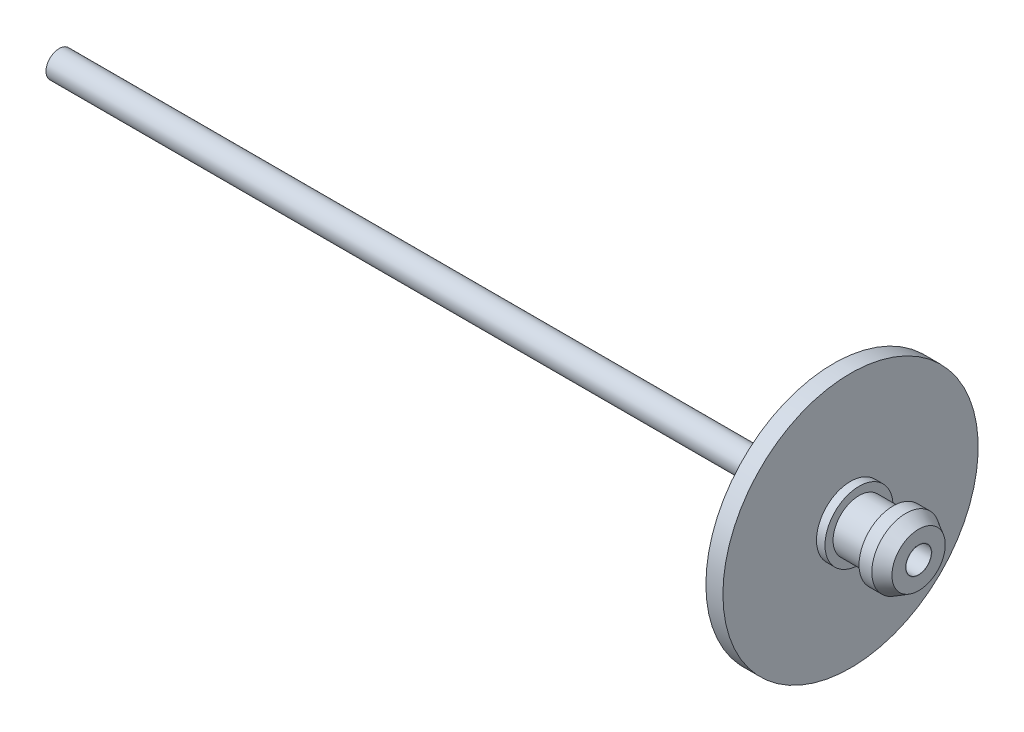
ISO-10303-21;
HEADER;
FILE_DESCRIPTION(('STEP AP214'),'2;1');
FILE_NAME('part.step','',(''),(''),'','','');
FILE_SCHEMA(('AUTOMOTIVE_DESIGN { 1 0 10303 214 1 1 1 1 }'));
ENDSEC;
DATA;
#1=APPLICATION_CONTEXT('core data for automotive mechanical design processes');
#2=APPLICATION_PROTOCOL_DEFINITION('international standard','automotive_design',2000,#1);
#3=PRODUCT_CONTEXT('',#1,'mechanical');
#4=PRODUCT('Part','Part','',(#3));
#5=PRODUCT_RELATED_PRODUCT_CATEGORY('part','',(#4));
#6=PRODUCT_DEFINITION_FORMATION('','',#4);
#7=PRODUCT_DEFINITION_CONTEXT('part definition',#1,'design');
#8=PRODUCT_DEFINITION('design','',#6,#7);
#9=PRODUCT_DEFINITION_SHAPE('','',#8);
#10=(LENGTH_UNIT() NAMED_UNIT(*) SI_UNIT(.MILLI.,.METRE.));
#11=(NAMED_UNIT(*) PLANE_ANGLE_UNIT() SI_UNIT($,.RADIAN.));
#12=(NAMED_UNIT(*) SI_UNIT($,.STERADIAN.) SOLID_ANGLE_UNIT());
#13=UNCERTAINTY_MEASURE_WITH_UNIT(LENGTH_MEASURE(1.E-05),#10,'distance_accuracy_value','');
#14=(GEOMETRIC_REPRESENTATION_CONTEXT(3) GLOBAL_UNCERTAINTY_ASSIGNED_CONTEXT((#13)) GLOBAL_UNIT_ASSIGNED_CONTEXT((#10,
#11,#12)) REPRESENTATION_CONTEXT('',''));
#15=CARTESIAN_POINT('',(0.,0.,0.));
#16=DIRECTION('',(0.,0.,1.));
#17=DIRECTION('',(1.,0.,0.));
#18=AXIS2_PLACEMENT_3D('',#15,#16,#17);
#19=CARTESIAN_POINT('',(-182.,0.,0.));
#20=DIRECTION('',(1.,0.,0.));
#21=DIRECTION('',(0.,0.,-1.));
#22=AXIS2_PLACEMENT_3D('',#19,#20,#21);
#23=CYLINDRICAL_SURFACE('',#22,3.1);
#24=CARTESIAN_POINT('',(-182.,0.,0.));
#25=DIRECTION('',(1.,0.,0.));
#26=DIRECTION('',(0.,0.,-1.));
#27=AXIS2_PLACEMENT_3D('',#24,#25,#26);
#28=CIRCLE('',#27,3.1);
#29=CARTESIAN_POINT('',(-182.,0.,-3.1));
#30=VERTEX_POINT('',#29);
#31=EDGE_CURVE('E11',#30,#30,#28,.T.);
#32=ORIENTED_EDGE('',*,*,#31,.T.);
#33=EDGE_LOOP('',(#32));
#34=FACE_BOUND('',#33,.T.);
#35=CARTESIAN_POINT('',(20.,0.,0.));
#36=DIRECTION('',(1.,0.,0.));
#37=DIRECTION('',(0.,0.,-1.));
#38=AXIS2_PLACEMENT_3D('',#35,#36,#37);
#39=CIRCLE('',#38,3.1);
#40=CARTESIAN_POINT('',(20.,0.,-3.1));
#41=VERTEX_POINT('',#40);
#42=EDGE_CURVE('E52',#41,#41,#39,.T.);
#43=ORIENTED_EDGE('',*,*,#42,.F.);
#44=EDGE_LOOP('',(#43));
#45=FACE_BOUND('',#44,.T.);
#46=ADVANCED_FACE('F49',(#34,#45),#23,.T.);
#47=CARTESIAN_POINT('',(-182.,0.,0.));
#48=DIRECTION('',(1.,0.,0.));
#49=DIRECTION('',(0.,0.,-1.));
#50=AXIS2_PLACEMENT_3D('',#47,#48,#49);
#51=PLANE('',#50);
#52=CARTESIAN_POINT('',(-182.,0.,0.));
#53=DIRECTION('',(1.,0.,0.));
#54=DIRECTION('',(0.,0.,-1.));
#55=AXIS2_PLACEMENT_3D('',#52,#53,#54);
#56=CIRCLE('',#55,3.);
#57=CARTESIAN_POINT('',(-182.,0.,-3.));
#58=VERTEX_POINT('',#57);
#59=EDGE_CURVE('E59',#58,#58,#56,.T.);
#60=ORIENTED_EDGE('',*,*,#59,.T.);
#61=EDGE_LOOP('',(#60));
#62=FACE_BOUND('',#61,.T.);
#63=ORIENTED_EDGE('',*,*,#31,.F.);
#64=EDGE_LOOP('',(#63));
#65=FACE_BOUND('',#64,.T.);
#66=ADVANCED_FACE('F67',(#62,#65),#51,.F.);
#67=CARTESIAN_POINT('',(20.,0.,0.));
#68=DIRECTION('',(1.,0.,0.));
#69=DIRECTION('',(0.,0.,-1.));
#70=AXIS2_PLACEMENT_3D('',#67,#68,#69);
#71=PLANE('',#70);
#72=CARTESIAN_POINT('',(20.,0.,0.));
#73=DIRECTION('',(1.,0.,0.));
#74=DIRECTION('',(0.,0.,-1.));
#75=AXIS2_PLACEMENT_3D('',#72,#73,#74);
#76=CIRCLE('',#75,3.);
#77=CARTESIAN_POINT('',(20.,0.,-3.));
#78=VERTEX_POINT('',#77);
#79=EDGE_CURVE('E61',#78,#78,#76,.T.);
#80=ORIENTED_EDGE('',*,*,#79,.F.);
#81=EDGE_LOOP('',(#80));
#82=FACE_BOUND('',#81,.T.);
#83=ORIENTED_EDGE('',*,*,#42,.T.);
#84=EDGE_LOOP('',(#83));
#85=FACE_BOUND('',#84,.T.);
#86=ADVANCED_FACE('F73',(#82,#85),#71,.T.);
#87=CARTESIAN_POINT('',(-182.,0.,0.));
#88=DIRECTION('',(1.,0.,0.));
#89=DIRECTION('',(0.,0.,-1.));
#90=AXIS2_PLACEMENT_3D('',#87,#88,#89);
#91=CYLINDRICAL_SURFACE('',#90,3.);
#92=ORIENTED_EDGE('',*,*,#59,.F.);
#93=EDGE_LOOP('',(#92));
#94=FACE_BOUND('',#93,.T.);
#95=ORIENTED_EDGE('',*,*,#79,.T.);
#96=EDGE_LOOP('',(#95));
#97=FACE_BOUND('',#96,.T.);
#98=ADVANCED_FACE('F70',(#94,#97),#91,.F.);
#99=CLOSED_SHELL('',(#46,#66,#86,#98));
#100=MANIFOLD_SOLID_BREP('B2_NOT_SHOWN',#99);
#101=CARTESIAN_POINT('',(0.,21.958452657574,0.));
#102=DIRECTION('',(1.,0.,0.));
#103=DIRECTION('',(0.,0.,-1.));
#104=AXIS2_PLACEMENT_3D('',#101,#102,#103);
#105=PLANE('',#104);
#106=CARTESIAN_POINT('',(0.,0.,0.));
#107=DIRECTION('',(-1.,0.,0.));
#108=DIRECTION('',(0.,0.,1.));
#109=AXIS2_PLACEMENT_3D('',#106,#107,#108);
#110=CIRCLE('',#109,3.1);
#111=CARTESIAN_POINT('',(0.,0.,3.1));
#112=VERTEX_POINT('',#111);
#113=EDGE_CURVE('E153',#112,#112,#110,.T.);
#114=ORIENTED_EDGE('',*,*,#113,.F.);
#115=EDGE_LOOP('',(#114));
#116=FACE_BOUND('',#115,.T.);
#117=CARTESIAN_POINT('',(0.,0.,0.));
#118=DIRECTION('',(-1.,0.,0.));
#119=DIRECTION('',(0.,0.,1.));
#120=AXIS2_PLACEMENT_3D('',#117,#118,#119);
#121=CIRCLE('',#120,30.);
#122=CARTESIAN_POINT('',(0.,0.,30.));
#123=VERTEX_POINT('',#122);
#124=EDGE_CURVE('E48',#123,#123,#121,.T.);
#125=ORIENTED_EDGE('',*,*,#124,.T.);
#126=EDGE_LOOP('',(#125));
#127=FACE_BOUND('',#126,.T.);
#128=ADVANCED_FACE('F111',(#116,#127),#105,.F.);
#129=CARTESIAN_POINT('',(0.,0.,0.));
#130=DIRECTION('',(-1.,0.,0.));
#131=DIRECTION('',(0.,0.,1.));
#132=AXIS2_PLACEMENT_3D('',#129,#130,#131);
#133=CYLINDRICAL_SURFACE('',#132,30.);
#134=ORIENTED_EDGE('',*,*,#124,.F.);
#135=EDGE_LOOP('',(#134));
#136=FACE_BOUND('',#135,.T.);
#137=CARTESIAN_POINT('',(4.,0.,0.));
#138=DIRECTION('',(-1.,0.,0.));
#139=DIRECTION('',(0.,0.,1.));
#140=AXIS2_PLACEMENT_3D('',#137,#138,#139);
#141=CIRCLE('',#140,30.);
#142=CARTESIAN_POINT('',(4.,0.,30.));
#143=VERTEX_POINT('',#142);
#144=EDGE_CURVE('E118',#143,#143,#141,.T.);
#145=ORIENTED_EDGE('',*,*,#144,.T.);
#146=EDGE_LOOP('',(#145));
#147=FACE_BOUND('',#146,.T.);
#148=ADVANCED_FACE('F160',(#136,#147),#133,.T.);
#149=CARTESIAN_POINT('',(4.,30.,0.));
#150=DIRECTION('',(-1.,0.,0.));
#151=DIRECTION('',(0.,0.,1.));
#152=AXIS2_PLACEMENT_3D('',#149,#150,#151);
#153=PLANE('',#152);
#154=ORIENTED_EDGE('',*,*,#144,.F.);
#155=EDGE_LOOP('',(#154));
#156=FACE_BOUND('',#155,.T.);
#157=CARTESIAN_POINT('',(4.,0.,0.));
#158=DIRECTION('',(-1.,0.,0.));
#159=DIRECTION('',(0.,0.,1.));
#160=AXIS2_PLACEMENT_3D('',#157,#158,#159);
#161=CIRCLE('',#160,8.);
#162=CARTESIAN_POINT('',(4.,0.,8.));
#163=VERTEX_POINT('',#162);
#164=EDGE_CURVE('E123',#163,#163,#161,.T.);
#165=ORIENTED_EDGE('',*,*,#164,.T.);
#166=EDGE_LOOP('',(#165));
#167=FACE_BOUND('',#166,.T.);
#168=ADVANCED_FACE('F164',(#156,#167),#153,.F.);
#169=CARTESIAN_POINT('',(0.,0.,0.));
#170=DIRECTION('',(-1.,0.,0.));
#171=DIRECTION('',(0.,0.,1.));
#172=AXIS2_PLACEMENT_3D('',#169,#170,#171);
#173=CYLINDRICAL_SURFACE('',#172,8.);
#174=ORIENTED_EDGE('',*,*,#164,.F.);
#175=EDGE_LOOP('',(#174));
#176=FACE_BOUND('',#175,.T.);
#177=CARTESIAN_POINT('',(5.99577866496982,0.,0.));
#178=DIRECTION('',(-1.,0.,0.));
#179=DIRECTION('',(0.,0.,1.));
#180=AXIS2_PLACEMENT_3D('',#177,#178,#179);
#181=CIRCLE('',#180,8.);
#182=CARTESIAN_POINT('',(5.99577866496982,0.,8.));
#183=VERTEX_POINT('',#182);
#184=EDGE_CURVE('E128',#183,#183,#181,.T.);
#185=ORIENTED_EDGE('',*,*,#184,.T.);
#186=EDGE_LOOP('',(#185));
#187=FACE_BOUND('',#186,.T.);
#188=ADVANCED_FACE('F169',(#176,#187),#173,.T.);
#189=CARTESIAN_POINT('',(5.99577866496982,8.,0.));
#190=DIRECTION('',(-1.,0.,0.));
#191=DIRECTION('',(0.,0.,1.));
#192=AXIS2_PLACEMENT_3D('',#189,#190,#191);
#193=PLANE('',#192);
#194=ORIENTED_EDGE('',*,*,#184,.F.);
#195=EDGE_LOOP('',(#194));
#196=FACE_BOUND('',#195,.T.);
#197=CARTESIAN_POINT('',(5.99577866496982,0.,0.));
#198=DIRECTION('',(-1.,0.,0.));
#199=DIRECTION('',(0.,0.,1.));
#200=AXIS2_PLACEMENT_3D('',#197,#198,#199);
#201=CIRCLE('',#200,6.1);
#202=CARTESIAN_POINT('',(5.99577866496982,0.,6.1));
#203=VERTEX_POINT('',#202);
#204=EDGE_CURVE('E133',#203,#203,#201,.T.);
#205=ORIENTED_EDGE('',*,*,#204,.T.);
#206=EDGE_LOOP('',(#205));
#207=FACE_BOUND('',#206,.T.);
#208=ADVANCED_FACE('F175',(#196,#207),#193,.F.);
#209=CARTESIAN_POINT('',(0.,0.,0.));
#210=DIRECTION('',(-1.,0.,0.));
#211=DIRECTION('',(0.,0.,1.));
#212=AXIS2_PLACEMENT_3D('',#209,#210,#211);
#213=CYLINDRICAL_SURFACE('',#212,6.1);
#214=ORIENTED_EDGE('',*,*,#204,.F.);
#215=EDGE_LOOP('',(#214));
#216=FACE_BOUND('',#215,.T.);
#217=CARTESIAN_POINT('',(13.9957786649698,0.,0.));
#218=DIRECTION('',(-1.,0.,0.));
#219=DIRECTION('',(0.,0.,1.));
#220=AXIS2_PLACEMENT_3D('',#217,#218,#219);
#221=CIRCLE('',#220,6.1);
#222=CARTESIAN_POINT('',(13.9957786649698,0.,6.1));
#223=VERTEX_POINT('',#222);
#224=EDGE_CURVE('E136',#223,#223,#221,.T.);
#225=ORIENTED_EDGE('',*,*,#224,.T.);
#226=EDGE_LOOP('',(#225));
#227=FACE_BOUND('',#226,.T.);
#228=ADVANCED_FACE('F179',(#216,#227),#213,.T.);
#229=CARTESIAN_POINT('',(13.9957786649698,6.1,0.));
#230=DIRECTION('',(1.,0.,0.));
#231=DIRECTION('',(0.,0.,-1.));
#232=AXIS2_PLACEMENT_3D('',#229,#230,#231);
#233=PLANE('',#232);
#234=ORIENTED_EDGE('',*,*,#224,.F.);
#235=EDGE_LOOP('',(#234));
#236=FACE_BOUND('',#235,.T.);
#237=CARTESIAN_POINT('',(13.9957786649698,0.,0.));
#238=DIRECTION('',(-1.,0.,0.));
#239=DIRECTION('',(0.,0.,1.));
#240=AXIS2_PLACEMENT_3D('',#237,#238,#239);
#241=CIRCLE('',#240,8.);
#242=CARTESIAN_POINT('',(13.9957786649698,0.,8.));
#243=VERTEX_POINT('',#242);
#244=EDGE_CURVE('E139',#243,#243,#241,.T.);
#245=ORIENTED_EDGE('',*,*,#244,.T.);
#246=EDGE_LOOP('',(#245));
#247=FACE_BOUND('',#246,.T.);
#248=ADVANCED_FACE('F183',(#236,#247),#233,.F.);
#249=CARTESIAN_POINT('',(0.,0.,0.));
#250=DIRECTION('',(-1.,0.,0.));
#251=DIRECTION('',(0.,0.,1.));
#252=AXIS2_PLACEMENT_3D('',#249,#250,#251);
#253=CYLINDRICAL_SURFACE('',#252,8.);
#254=ORIENTED_EDGE('',*,*,#244,.F.);
#255=EDGE_LOOP('',(#254));
#256=FACE_BOUND('',#255,.T.);
#257=CARTESIAN_POINT('',(17.,0.,0.));
#258=DIRECTION('',(-1.,0.,0.));
#259=DIRECTION('',(0.,0.,1.));
#260=AXIS2_PLACEMENT_3D('',#257,#258,#259);
#261=CIRCLE('',#260,8.);
#262=CARTESIAN_POINT('',(17.,0.,8.));
#263=VERTEX_POINT('',#262);
#264=EDGE_CURVE('E142',#263,#263,#261,.T.);
#265=ORIENTED_EDGE('',*,*,#264,.T.);
#266=EDGE_LOOP('',(#265));
#267=FACE_BOUND('',#266,.T.);
#268=ADVANCED_FACE('F187',(#256,#267),#253,.T.);
#269=CARTESIAN_POINT('',(20.,0.,0.));
#270=DIRECTION('',(-1.,0.,0.));
#271=DIRECTION('',(0.,0.,1.));
#272=AXIS2_PLACEMENT_3D('',#269,#270,#271);
#273=CONICAL_SURFACE('',#272,6.26794919243113,0.523598775598296);
#274=ORIENTED_EDGE('',*,*,#264,.F.);
#275=EDGE_LOOP('',(#274));
#276=FACE_BOUND('',#275,.T.);
#277=CARTESIAN_POINT('',(20.,0.,0.));
#278=DIRECTION('',(-1.,0.,0.));
#279=DIRECTION('',(0.,0.,1.));
#280=AXIS2_PLACEMENT_3D('',#277,#278,#279);
#281=CIRCLE('',#280,6.26794919243113);
#282=CARTESIAN_POINT('',(20.,0.,6.26794919243113));
#283=VERTEX_POINT('',#282);
#284=EDGE_CURVE('E146',#283,#283,#281,.T.);
#285=ORIENTED_EDGE('',*,*,#284,.T.);
#286=EDGE_LOOP('',(#285));
#287=FACE_BOUND('',#286,.T.);
#288=ADVANCED_FACE('F191',(#276,#287),#273,.T.);
#289=CARTESIAN_POINT('',(20.,6.26794919243113,0.));
#290=DIRECTION('',(-1.,0.,0.));
#291=DIRECTION('',(0.,0.,1.));
#292=AXIS2_PLACEMENT_3D('',#289,#290,#291);
#293=PLANE('',#292);
#294=ORIENTED_EDGE('',*,*,#284,.F.);
#295=EDGE_LOOP('',(#294));
#296=FACE_BOUND('',#295,.T.);
#297=CARTESIAN_POINT('',(20.,0.,0.));
#298=DIRECTION('',(-1.,0.,0.));
#299=DIRECTION('',(0.,0.,1.));
#300=AXIS2_PLACEMENT_3D('',#297,#298,#299);
#301=CIRCLE('',#300,3.1);
#302=CARTESIAN_POINT('',(20.,0.,3.1));
#303=VERTEX_POINT('',#302);
#304=EDGE_CURVE('E149',#303,#303,#301,.T.);
#305=ORIENTED_EDGE('',*,*,#304,.T.);
#306=EDGE_LOOP('',(#305));
#307=FACE_BOUND('',#306,.T.);
#308=ADVANCED_FACE('F195',(#296,#307),#293,.F.);
#309=CARTESIAN_POINT('',(0.,0.,0.));
#310=DIRECTION('',(-1.,0.,0.));
#311=DIRECTION('',(0.,0.,1.));
#312=AXIS2_PLACEMENT_3D('',#309,#310,#311);
#313=CYLINDRICAL_SURFACE('',#312,3.1);
#314=ORIENTED_EDGE('',*,*,#304,.F.);
#315=EDGE_LOOP('',(#314));
#316=FACE_BOUND('',#315,.T.);
#317=ORIENTED_EDGE('',*,*,#113,.T.);
#318=EDGE_LOOP('',(#317));
#319=FACE_BOUND('',#318,.T.);
#320=ADVANCED_FACE('F157',(#316,#319),#313,.F.);
#321=CLOSED_SHELL('',(#128,#148,#168,#188,#208,#228,#248,#268,#288,#308,#320));
#322=MANIFOLD_SOLID_BREP('B6',#321);
#323=ADVANCED_BREP_SHAPE_REPRESENTATION('',(#18,#100,#322),#14);
#324=SHAPE_DEFINITION_REPRESENTATION(#9,#323);
ENDSEC;
END-ISO-10303-21;
